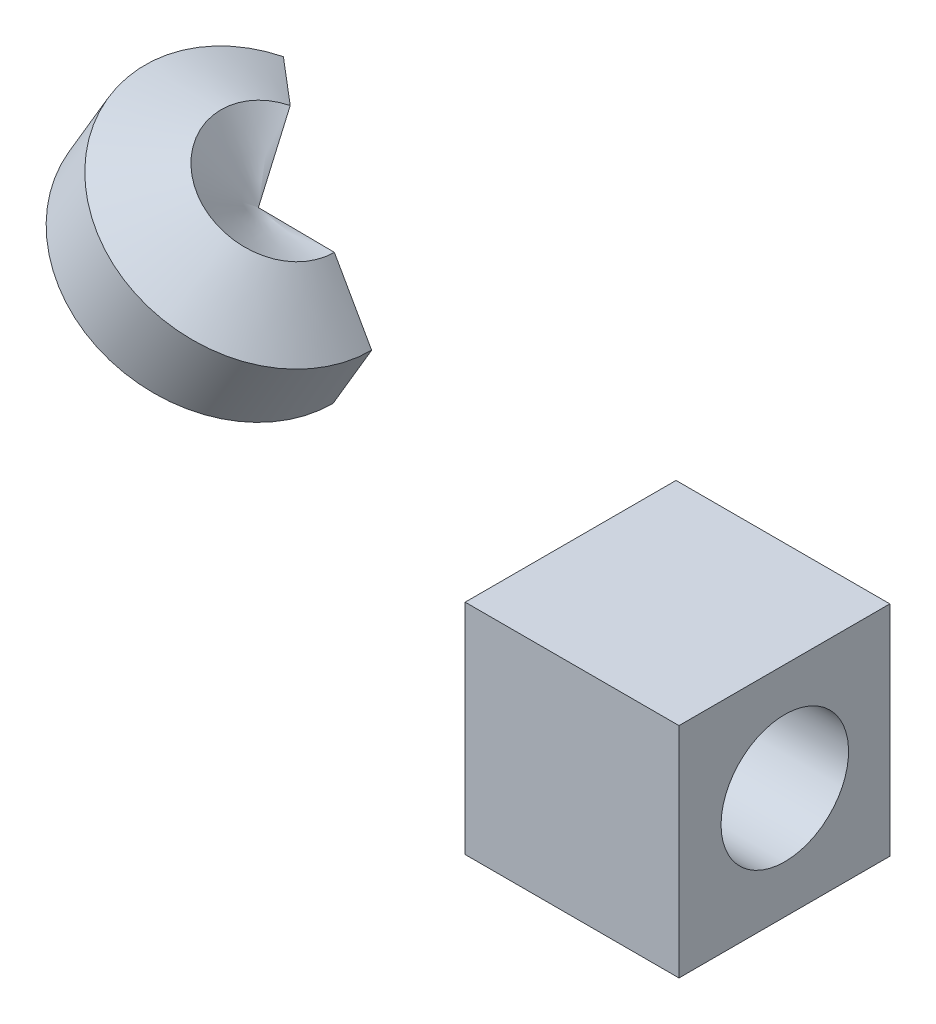
ISO-10303-21;
HEADER;
FILE_DESCRIPTION(('STEP AP214'),'2;1');
FILE_NAME('part.step','',(''),(''),'','','');
FILE_SCHEMA(('AUTOMOTIVE_DESIGN { 1 0 10303 214 1 1 1 1 }'));
ENDSEC;
DATA;
#1=APPLICATION_CONTEXT('core data for automotive mechanical design processes');
#2=APPLICATION_PROTOCOL_DEFINITION('international standard','automotive_design',2000,#1);
#3=PRODUCT_CONTEXT('',#1,'mechanical');
#4=PRODUCT('Part','Part','',(#3));
#5=PRODUCT_RELATED_PRODUCT_CATEGORY('part','',(#4));
#6=PRODUCT_DEFINITION_FORMATION('','',#4);
#7=PRODUCT_DEFINITION_CONTEXT('part definition',#1,'design');
#8=PRODUCT_DEFINITION('design','',#6,#7);
#9=PRODUCT_DEFINITION_SHAPE('','',#8);
#10=(LENGTH_UNIT() NAMED_UNIT(*) SI_UNIT(.MILLI.,.METRE.));
#11=(NAMED_UNIT(*) PLANE_ANGLE_UNIT() SI_UNIT($,.RADIAN.));
#12=(NAMED_UNIT(*) SI_UNIT($,.STERADIAN.) SOLID_ANGLE_UNIT());
#13=UNCERTAINTY_MEASURE_WITH_UNIT(LENGTH_MEASURE(1.E-05),#10,'distance_accuracy_value','');
#14=(GEOMETRIC_REPRESENTATION_CONTEXT(3) GLOBAL_UNCERTAINTY_ASSIGNED_CONTEXT((#13)) GLOBAL_UNIT_ASSIGNED_CONTEXT((#10,
#11,#12)) REPRESENTATION_CONTEXT('',''));
#15=CARTESIAN_POINT('',(0.,0.,0.));
#16=DIRECTION('',(0.,0.,1.));
#17=DIRECTION('',(1.,0.,0.));
#18=AXIS2_PLACEMENT_3D('',#15,#16,#17);
#19=CARTESIAN_POINT('',(0.,0.,22.));
#20=DIRECTION('',(0.,0.,1.));
#21=DIRECTION('',(1.,0.,0.));
#22=AXIS2_PLACEMENT_3D('',#19,#20,#21);
#23=PLANE('',#22);
#24=DIRECTION('',(0.491071983599509,-0.871118996993892,0.));
#25=VECTOR('',#24,1.);
#26=CARTESIAN_POINT('',(-10.5835576297316,-5.96622121283901,22.));
#27=LINE('',#26,#25);
#28=CARTESIAN_POINT('',(-41.2699752328692,48.4688152309865,22.));
#29=VERTEX_POINT('',#28);
#30=CARTESIAN_POINT('',(-37.3777730431551,41.5643869987982,22.));
#31=VERTEX_POINT('',#30);
#32=EDGE_CURVE('E63',#29,#31,#27,.T.);
#33=ORIENTED_EDGE('',*,*,#32,.F.);
#34=DIRECTION('',(-0.508875189316176,-0.860840311380936,0.));
#35=VECTOR('',#34,1.);
#36=CARTESIAN_POINT('',(-51.8152143853866,30.6299283168139,22.));
#37=LINE('',#36,#35);
#38=CARTESIAN_POINT('',(-37.2366660800447,55.2917753200385,22.));
#39=VERTEX_POINT('',#38);
#40=EDGE_CURVE('E68',#39,#29,#37,.T.);
#41=ORIENTED_EDGE('',*,*,#40,.F.);
#42=DIRECTION('',(-0.999947172915685,0.010278685612956,0.));
#43=VECTOR('',#42,1.);
#44=CARTESIAN_POINT('',(0.564362647369512,54.903209903125,22.));
#45=LINE('',#44,#43);
#46=CARTESIAN_POINT('',(-29.3111547375061,55.2103071769021,22.));
#47=VERTEX_POINT('',#46);
#48=EDGE_CURVE('E113',#47,#39,#45,.T.);
#49=ORIENTED_EDGE('',*,*,#48,.F.);
#50=DIRECTION('',(-0.491071983599509,0.871118996993892,0.));
#51=VECTOR('',#50,1.);
#52=CARTESIAN_POINT('',(1.37526286563152,0.775270733076611,22.));
#53=LINE('',#52,#51);
#54=CARTESIAN_POINT('',(-25.4189525477921,48.3058789447139,22.));
#55=VERTEX_POINT('',#54);
#56=EDGE_CURVE('E108',#55,#47,#53,.T.);
#57=ORIENTED_EDGE('',*,*,#56,.F.);
#58=DIRECTION('',(0.508875189316175,0.860840311380936,0.));
#59=VECTOR('',#58,1.);
#60=CARTESIAN_POINT('',(-39.9975008531339,23.6440319414892,22.));
#61=LINE('',#60,#59);
#62=CARTESIAN_POINT('',(-29.4522617006166,41.4829188556619,22.));
#63=VERTEX_POINT('',#62);
#64=EDGE_CURVE('E106',#63,#55,#61,.T.);
#65=ORIENTED_EDGE('',*,*,#64,.F.);
#66=DIRECTION('',(0.999947172915685,-0.010278685612956,0.));
#67=VECTOR('',#66,1.);
#68=CARTESIAN_POINT('',(0.423255684259082,41.1758215818848,22.));
#69=LINE('',#68,#67);
#70=EDGE_CURVE('E95',#31,#63,#69,.T.);
#71=ORIENTED_EDGE('',*,*,#70,.F.);
#72=EDGE_LOOP('',(#33,#41,#49,#57,#65,#71));
#73=FACE_BOUND('',#72,.T.);
#74=ADVANCED_FACE('F48',(#73),#23,.F.);
#75=CARTESIAN_POINT('',(-85.8090536219977,50.7249693463913,-23.4270532884509));
#76=DIRECTION('',(0.649684430041154,-0.384052980514599,-0.656059028990497));
#77=DIRECTION('',(-0.227215988252348,0.725453676015643,-0.649684430041154));
#78=AXIS2_PLACEMENT_3D('',#75,#76,#77);
#79=PLANE('',#78);
#80=DIRECTION('',(-0.743535884672882,-0.141295701787707,-0.653597668952418));
#81=VECTOR('',#80,1.);
#82=CARTESIAN_POINT('',(-87.7325172267091,39.6394397923704,-18.8424257211713));
#83=LINE('',#82,#81);
#84=CARTESIAN_POINT('',(-47.1631886417102,47.3489153827724,16.8196305974496));
#85=VERTEX_POINT('',#84);
#86=EDGE_CURVE('E102',#29,#85,#83,.T.);
#87=ORIENTED_EDGE('',*,*,#86,.T.);
#88=DIRECTION('',(-0.234660695356707,0.719544609593229,-0.653597668952418));
#89=VECTOR('',#88,1.);
#90=CARTESIAN_POINT('',(-56.0340729510375,74.5498787882494,-7.88833891278027));
#91=LINE('',#90,#89);
#92=CARTESIAN_POINT('',(-49.0230928977267,53.0519756236102,11.6392611948993));
#93=VERTEX_POINT('',#92);
#94=EDGE_CURVE('E98',#85,#93,#91,.T.);
#95=ORIENTED_EDGE('',*,*,#94,.T.);
#96=DIRECTION('',(0.508875189316176,0.860840311380936,0.));
#97=VECTOR('',#96,1.);
#98=CARTESIAN_POINT('',(-59.5683320502441,35.2130887094376,11.6392611948993));
#99=LINE('',#98,#97);
#100=CARTESIAN_POINT('',(-44.9897837449022,59.8749357126622,11.6392611948993));
#101=VERTEX_POINT('',#100);
#102=EDGE_CURVE('E117',#93,#101,#99,.T.);
#103=ORIENTED_EDGE('',*,*,#102,.T.);
#104=DIRECTION('',(0.743535884672882,0.141295701787707,0.653597668952418));
#105=VECTOR('',#104,1.);
#106=CARTESIAN_POINT('',(-85.5591123299011,52.1654601222602,-24.0227951237217));
#107=LINE('',#106,#105);
#108=CARTESIAN_POINT('',(-39.0965703360612,60.9948355608763,16.8196305974496));
#109=VERTEX_POINT('',#108);
#110=EDGE_CURVE('E120',#101,#109,#107,.T.);
#111=ORIENTED_EDGE('',*,*,#110,.T.);
#112=DIRECTION('',(0.234660695356707,-0.719544609593229,0.653597668952418));
#113=VECTOR('',#112,1.);
#114=CARTESIAN_POINT('',(-46.1075503893719,82.4927387255155,-2.7079695102299));
#115=LINE('',#114,#113);
#116=EDGE_CURVE('E123',#109,#39,#115,.T.);
#117=ORIENTED_EDGE('',*,*,#116,.T.);
#118=ORIENTED_EDGE('',*,*,#40,.T.);
#119=EDGE_LOOP('',(#87,#95,#103,#111,#117,#118));
#120=FACE_BOUND('',#119,.T.);
#121=ADVANCED_FACE('F134',(#120),#79,.T.);
#122=CARTESIAN_POINT('',(-41.2699752328692,48.4688152309865,22.));
#123=DIRECTION('',(-0.508875189316175,-0.860840311380936,0.));
#124=DIRECTION('',(0.860840311380936,-0.508875189316175,0.));
#125=AXIS2_PLACEMENT_3D('',#122,#123,#124);
#126=CONICAL_SURFACE('',#125,0.,1.0471975511966);
#127=CARTESIAN_POINT('',(-43.2866298092815,45.0573351864605,22.));
#128=DIRECTION('',(0.508875189316175,0.860840311380936,0.));
#129=DIRECTION('',(-0.860840311380936,0.508875189316175,0.));
#130=AXIS2_PLACEMENT_3D('',#127,#128,#129);
#131=CIRCLE('',#130,6.86405676872579);
#132=EDGE_CURVE('E12',#85,#31,#131,.T.);
#133=ORIENTED_EDGE('',*,*,#132,.F.);
#134=ORIENTED_EDGE('',*,*,#86,.F.);
#135=ORIENTED_EDGE('',*,*,#32,.T.);
#136=EDGE_LOOP('',(#133,#134,#135));
#137=FACE_BOUND('',#136,.T.);
#138=ADVANCED_FACE('F101',(#137),#126,.F.);
#139=CARTESIAN_POINT('',(-35.2200115036325,58.7032553645644,22.));
#140=DIRECTION('',(0.508875189316175,0.860840311380936,0.));
#141=DIRECTION('',(-0.860840311380936,0.508875189316175,0.));
#142=AXIS2_PLACEMENT_3D('',#139,#140,#141);
#143=CONICAL_SURFACE('',#142,6.86405676872578,1.0471975511966);
#144=ORIENTED_EDGE('',*,*,#48,.T.);
#145=ORIENTED_EDGE('',*,*,#116,.F.);
#146=CARTESIAN_POINT('',(-35.2200115036325,58.7032553645644,22.));
#147=DIRECTION('',(0.508875189316175,0.860840311380936,0.));
#148=DIRECTION('',(-0.860840311380936,0.508875189316175,0.));
#149=AXIS2_PLACEMENT_3D('',#146,#147,#148);
#150=CIRCLE('',#149,6.86405676872578);
#151=EDGE_CURVE('E127',#109,#47,#150,.T.);
#152=ORIENTED_EDGE('',*,*,#151,.T.);
#153=EDGE_LOOP('',(#144,#145,#152));
#154=FACE_BOUND('',#153,.T.);
#155=ADVANCED_FACE('F138',(#154),#143,.F.);
#156=CARTESIAN_POINT('',(-37.2366660800447,55.2917753200385,22.));
#157=DIRECTION('',(-0.508875189316175,-0.860840311380936,0.));
#158=DIRECTION('',(0.860840311380936,-0.508875189316175,0.));
#159=AXIS2_PLACEMENT_3D('',#156,#157,#158);
#160=CONICAL_SURFACE('',#159,13.7281135374516,1.0471975511966);
#161=ORIENTED_EDGE('',*,*,#151,.F.);
#162=ORIENTED_EDGE('',*,*,#110,.F.);
#163=CARTESIAN_POINT('',(-37.2366660800447,55.2917753200385,22.));
#164=DIRECTION('',(0.508875189316175,0.860840311380936,0.));
#165=DIRECTION('',(-0.860840311380936,0.508875189316175,0.));
#166=AXIS2_PLACEMENT_3D('',#163,#164,#165);
#167=CIRCLE('',#166,13.7281135374516);
#168=EDGE_CURVE('E129',#101,#55,#167,.T.);
#169=ORIENTED_EDGE('',*,*,#168,.T.);
#170=ORIENTED_EDGE('',*,*,#56,.T.);
#171=EDGE_LOOP('',(#161,#162,#169,#170));
#172=FACE_BOUND('',#171,.T.);
#173=ADVANCED_FACE('F140',(#172),#160,.T.);
#174=CARTESIAN_POINT('',(-37.2366660800447,55.2917753200385,22.));
#175=DIRECTION('',(0.508875189316175,0.860840311380936,0.));
#176=DIRECTION('',(-0.860840311380936,0.508875189316175,0.));
#177=AXIS2_PLACEMENT_3D('',#174,#175,#176);
#178=CYLINDRICAL_SURFACE('',#177,13.7281135374516);
#179=ORIENTED_EDGE('',*,*,#168,.F.);
#180=ORIENTED_EDGE('',*,*,#102,.F.);
#181=CARTESIAN_POINT('',(-41.2699752328692,48.4688152309865,22.));
#182=DIRECTION('',(0.508875189316175,0.860840311380936,0.));
#183=DIRECTION('',(-0.860840311380936,0.508875189316175,0.));
#184=AXIS2_PLACEMENT_3D('',#181,#182,#183);
#185=CIRCLE('',#184,13.7281135374516);
#186=EDGE_CURVE('E56',#93,#63,#185,.T.);
#187=ORIENTED_EDGE('',*,*,#186,.T.);
#188=ORIENTED_EDGE('',*,*,#64,.T.);
#189=EDGE_LOOP('',(#179,#180,#187,#188));
#190=FACE_BOUND('',#189,.T.);
#191=ADVANCED_FACE('F132',(#190),#178,.T.);
#192=CARTESIAN_POINT('',(-43.2866298092815,45.0573351864605,22.));
#193=DIRECTION('',(0.508875189316175,0.860840311380936,0.));
#194=DIRECTION('',(-0.860840311380936,0.508875189316175,0.));
#195=AXIS2_PLACEMENT_3D('',#192,#193,#194);
#196=CONICAL_SURFACE('',#195,6.86405676872579,1.0471975511966);
#197=ORIENTED_EDGE('',*,*,#186,.F.);
#198=ORIENTED_EDGE('',*,*,#94,.F.);
#199=ORIENTED_EDGE('',*,*,#132,.T.);
#200=ORIENTED_EDGE('',*,*,#70,.T.);
#201=EDGE_LOOP('',(#197,#198,#199,#200));
#202=FACE_BOUND('',#201,.T.);
#203=ADVANCED_FACE('F50',(#202),#196,.T.);
#204=CLOSED_SHELL('',(#74,#121,#138,#155,#173,#191,#203));
#205=MANIFOLD_SOLID_BREP('B2',#204);
#206=CARTESIAN_POINT('',(-15.6613759390893,30.4258241479228,22.));
#207=DIRECTION('',(1.,0.,0.));
#208=DIRECTION('',(0.,1.,0.));
#209=AXIS2_PLACEMENT_3D('',#206,#207,#208);
#210=PLANE('',#209);
#211=CARTESIAN_POINT('',(-15.6613759390893,19.2585892634035,10.9597946726933));
#212=DIRECTION('',(-1.,0.,0.));
#213=DIRECTION('',(0.,-1.,0.));
#214=AXIS2_PLACEMENT_3D('',#211,#212,#213);
#215=CIRCLE('',#214,6.65252489619527);
#216=CARTESIAN_POINT('',(-15.6613759390893,12.6060643672083,10.9597946726933));
#217=VERTEX_POINT('',#216);
#218=EDGE_CURVE('E296',#217,#217,#215,.T.);
#219=ORIENTED_EDGE('',*,*,#218,.F.);
#220=EDGE_LOOP('',(#219));
#221=FACE_BOUND('',#220,.T.);
#222=DIRECTION('',(0.,-1.,0.));
#223=VECTOR('',#222,1.);
#224=CARTESIAN_POINT('',(-15.6613759390893,30.4258241479228,0.));
#225=LINE('',#224,#223);
#226=CARTESIAN_POINT('',(-15.6613759390893,30.4258241479228,0.));
#227=VERTEX_POINT('',#226);
#228=CARTESIAN_POINT('',(-15.6613759390893,7.6191043518179,0.));
#229=VERTEX_POINT('',#228);
#230=EDGE_CURVE('E283',#227,#229,#225,.T.);
#231=ORIENTED_EDGE('',*,*,#230,.T.);
#232=DIRECTION('',(0.,0.,-1.));
#233=VECTOR('',#232,1.);
#234=CARTESIAN_POINT('',(-15.6613759390893,7.6191043518179,22.));
#235=LINE('',#234,#233);
#236=CARTESIAN_POINT('',(-15.6613759390893,7.6191043518179,22.));
#237=VERTEX_POINT('',#236);
#238=EDGE_CURVE('E46',#237,#229,#235,.T.);
#239=ORIENTED_EDGE('',*,*,#238,.F.);
#240=DIRECTION('',(0.,-1.,0.));
#241=VECTOR('',#240,1.);
#242=CARTESIAN_POINT('',(-15.6613759390893,30.4258241479228,22.));
#243=LINE('',#242,#241);
#244=CARTESIAN_POINT('',(-15.6613759390893,30.4258241479228,22.));
#245=VERTEX_POINT('',#244);
#246=EDGE_CURVE('E270',#245,#237,#243,.T.);
#247=ORIENTED_EDGE('',*,*,#246,.F.);
#248=DIRECTION('',(0.,0.,-1.));
#249=VECTOR('',#248,1.);
#250=CARTESIAN_POINT('',(-15.6613759390893,30.4258241479228,22.));
#251=LINE('',#250,#249);
#252=EDGE_CURVE('E279',#245,#227,#251,.T.);
#253=ORIENTED_EDGE('',*,*,#252,.T.);
#254=EDGE_LOOP('',(#231,#239,#247,#253));
#255=FACE_BOUND('',#254,.T.);
#256=ADVANCED_FACE('F218',(#221,#255),#210,.F.);
#257=CARTESIAN_POINT('',(-15.6613759390893,7.6191043518179,22.));
#258=DIRECTION('',(0.,1.,0.));
#259=DIRECTION('',(0.,0.,1.));
#260=AXIS2_PLACEMENT_3D('',#257,#258,#259);
#261=PLANE('',#260);
#262=DIRECTION('',(1.,0.,0.));
#263=VECTOR('',#262,1.);
#264=CARTESIAN_POINT('',(-15.6613759390893,7.6191043518179,0.));
#265=LINE('',#264,#263);
#266=CARTESIAN_POINT('',(6.64718466418596,7.6191043518179,0.));
#267=VERTEX_POINT('',#266);
#268=EDGE_CURVE('E274',#229,#267,#265,.T.);
#269=ORIENTED_EDGE('',*,*,#268,.T.);
#270=DIRECTION('',(0.,0.,-1.));
#271=VECTOR('',#270,1.);
#272=CARTESIAN_POINT('',(6.64718466418596,7.6191043518179,22.));
#273=LINE('',#272,#271);
#274=CARTESIAN_POINT('',(6.64718466418596,7.6191043518179,22.));
#275=VERTEX_POINT('',#274);
#276=EDGE_CURVE('E227',#275,#267,#273,.T.);
#277=ORIENTED_EDGE('',*,*,#276,.F.);
#278=DIRECTION('',(1.,0.,0.));
#279=VECTOR('',#278,1.);
#280=CARTESIAN_POINT('',(-15.6613759390893,7.6191043518179,22.));
#281=LINE('',#280,#279);
#282=EDGE_CURVE('E265',#237,#275,#281,.T.);
#283=ORIENTED_EDGE('',*,*,#282,.F.);
#284=ORIENTED_EDGE('',*,*,#238,.T.);
#285=EDGE_LOOP('',(#269,#277,#283,#284));
#286=FACE_BOUND('',#285,.T.);
#287=ADVANCED_FACE('F273',(#286),#261,.F.);
#288=CARTESIAN_POINT('',(6.64718466418596,30.4258241479228,22.));
#289=DIRECTION('',(-1.,0.,0.));
#290=DIRECTION('',(0.,0.,1.));
#291=AXIS2_PLACEMENT_3D('',#288,#289,#290);
#292=PLANE('',#291);
#293=CARTESIAN_POINT('',(6.64718466418596,19.2585892634036,10.9597946726933));
#294=DIRECTION('',(-1.,0.,0.));
#295=DIRECTION('',(0.,0.,1.));
#296=AXIS2_PLACEMENT_3D('',#293,#294,#295);
#297=CIRCLE('',#296,6.65252489619527);
#298=CARTESIAN_POINT('',(6.64718466418596,19.2585892634036,17.6123195688885));
#299=VERTEX_POINT('',#298);
#300=EDGE_CURVE('E221',#299,#299,#297,.T.);
#301=ORIENTED_EDGE('',*,*,#300,.T.);
#302=EDGE_LOOP('',(#301));
#303=FACE_BOUND('',#302,.T.);
#304=DIRECTION('',(0.,1.,0.));
#305=VECTOR('',#304,1.);
#306=CARTESIAN_POINT('',(6.64718466418596,30.4258241479228,0.));
#307=LINE('',#306,#305);
#308=CARTESIAN_POINT('',(6.64718466418596,30.4258241479228,0.));
#309=VERTEX_POINT('',#308);
#310=EDGE_CURVE('E252',#267,#309,#307,.T.);
#311=ORIENTED_EDGE('',*,*,#310,.T.);
#312=DIRECTION('',(0.,0.,-1.));
#313=VECTOR('',#312,1.);
#314=CARTESIAN_POINT('',(6.64718466418596,30.4258241479228,22.));
#315=LINE('',#314,#313);
#316=CARTESIAN_POINT('',(6.64718466418596,30.4258241479228,22.));
#317=VERTEX_POINT('',#316);
#318=EDGE_CURVE('E275',#317,#309,#315,.T.);
#319=ORIENTED_EDGE('',*,*,#318,.F.);
#320=DIRECTION('',(0.,1.,0.));
#321=VECTOR('',#320,1.);
#322=CARTESIAN_POINT('',(6.64718466418596,30.4258241479228,22.));
#323=LINE('',#322,#321);
#324=EDGE_CURVE('E268',#275,#317,#323,.T.);
#325=ORIENTED_EDGE('',*,*,#324,.F.);
#326=ORIENTED_EDGE('',*,*,#276,.T.);
#327=EDGE_LOOP('',(#311,#319,#325,#326));
#328=FACE_BOUND('',#327,.T.);
#329=ADVANCED_FACE('F277',(#303,#328),#292,.F.);
#330=CARTESIAN_POINT('',(-15.6613759390893,30.4258241479228,22.));
#331=DIRECTION('',(0.,-1.,0.));
#332=DIRECTION('',(0.,0.,-1.));
#333=AXIS2_PLACEMENT_3D('',#330,#331,#332);
#334=PLANE('',#333);
#335=DIRECTION('',(-1.,0.,0.));
#336=VECTOR('',#335,1.);
#337=CARTESIAN_POINT('',(-15.6613759390893,30.4258241479228,0.));
#338=LINE('',#337,#336);
#339=EDGE_CURVE('E258',#309,#227,#338,.T.);
#340=ORIENTED_EDGE('',*,*,#339,.T.);
#341=ORIENTED_EDGE('',*,*,#252,.F.);
#342=DIRECTION('',(-1.,0.,0.));
#343=VECTOR('',#342,1.);
#344=CARTESIAN_POINT('',(-15.6613759390893,30.4258241479228,22.));
#345=LINE('',#344,#343);
#346=EDGE_CURVE('E235',#317,#245,#345,.T.);
#347=ORIENTED_EDGE('',*,*,#346,.F.);
#348=ORIENTED_EDGE('',*,*,#318,.T.);
#349=EDGE_LOOP('',(#340,#341,#347,#348));
#350=FACE_BOUND('',#349,.T.);
#351=ADVANCED_FACE('F290',(#350),#334,.F.);
#352=CARTESIAN_POINT('',(0.,0.,22.));
#353=DIRECTION('',(0.,0.,1.));
#354=DIRECTION('',(1.,0.,0.));
#355=AXIS2_PLACEMENT_3D('',#352,#353,#354);
#356=PLANE('',#355);
#357=ORIENTED_EDGE('',*,*,#246,.T.);
#358=ORIENTED_EDGE('',*,*,#282,.T.);
#359=ORIENTED_EDGE('',*,*,#324,.T.);
#360=ORIENTED_EDGE('',*,*,#346,.T.);
#361=EDGE_LOOP('',(#357,#358,#359,#360));
#362=FACE_BOUND('',#361,.T.);
#363=ADVANCED_FACE('F266',(#362),#356,.T.);
#364=CARTESIAN_POINT('',(0.,0.,0.));
#365=DIRECTION('',(0.,0.,1.));
#366=DIRECTION('',(1.,0.,0.));
#367=AXIS2_PLACEMENT_3D('',#364,#365,#366);
#368=PLANE('',#367);
#369=ORIENTED_EDGE('',*,*,#230,.F.);
#370=ORIENTED_EDGE('',*,*,#339,.F.);
#371=ORIENTED_EDGE('',*,*,#310,.F.);
#372=ORIENTED_EDGE('',*,*,#268,.F.);
#373=EDGE_LOOP('',(#369,#370,#371,#372));
#374=FACE_BOUND('',#373,.T.);
#375=ADVANCED_FACE('F293',(#374),#368,.F.);
#376=CARTESIAN_POINT('',(17.3386240609107,19.2585892634036,10.9597946726933));
#377=DIRECTION('',(-1.,0.,0.));
#378=DIRECTION('',(0.,-1.,0.));
#379=AXIS2_PLACEMENT_3D('',#376,#377,#378);
#380=CYLINDRICAL_SURFACE('',#379,6.65252489619527);
#381=ORIENTED_EDGE('',*,*,#218,.T.);
#382=EDGE_LOOP('',(#381));
#383=FACE_BOUND('',#382,.T.);
#384=ORIENTED_EDGE('',*,*,#300,.F.);
#385=EDGE_LOOP('',(#384));
#386=FACE_BOUND('',#385,.T.);
#387=ADVANCED_FACE('F304',(#383,#386),#380,.F.);
#388=CLOSED_SHELL('',(#256,#287,#329,#351,#363,#375,#387));
#389=MANIFOLD_SOLID_BREP('B6',#388);
#390=ADVANCED_BREP_SHAPE_REPRESENTATION('',(#18,#205,#389),#14);
#391=SHAPE_DEFINITION_REPRESENTATION(#9,#390);
ENDSEC;
END-ISO-10303-21;
